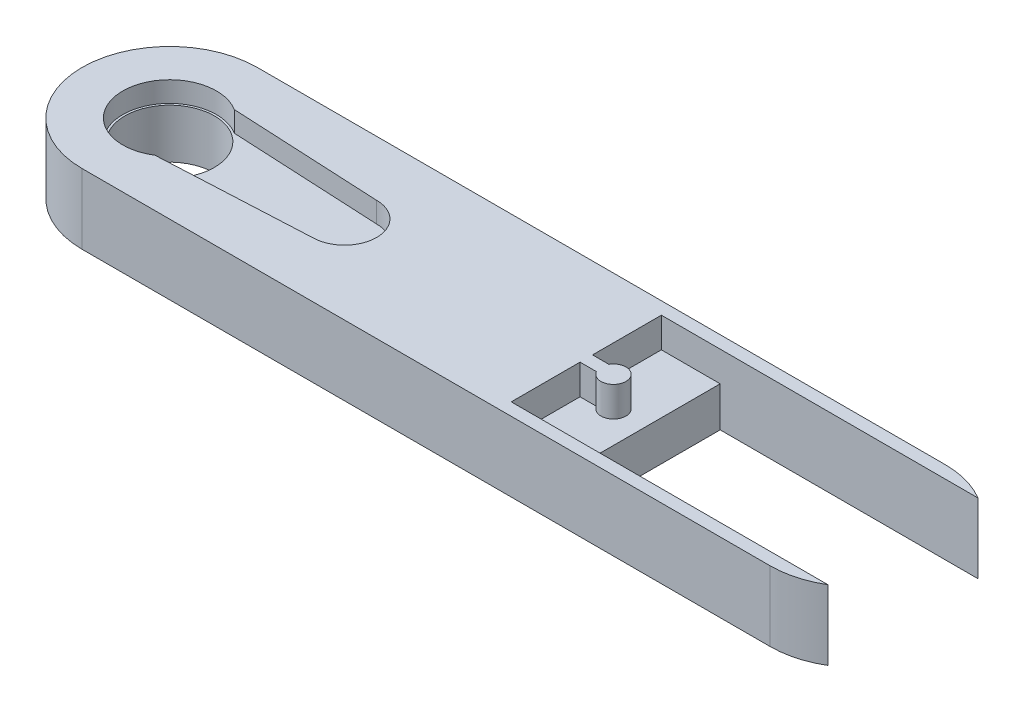
ISO-10303-21;
HEADER;
FILE_DESCRIPTION(('STEP AP214'),'2;1');
FILE_NAME('part.step','',(''),(''),'','','');
FILE_SCHEMA(('AUTOMOTIVE_DESIGN { 1 0 10303 214 1 1 1 1 }'));
ENDSEC;
DATA;
#1=APPLICATION_CONTEXT('core data for automotive mechanical design processes');
#2=APPLICATION_PROTOCOL_DEFINITION('international standard','automotive_design',2000,#1);
#3=PRODUCT_CONTEXT('',#1,'mechanical');
#4=PRODUCT('Part','Part','',(#3));
#5=PRODUCT_RELATED_PRODUCT_CATEGORY('part','',(#4));
#6=PRODUCT_DEFINITION_FORMATION('','',#4);
#7=PRODUCT_DEFINITION_CONTEXT('part definition',#1,'design');
#8=PRODUCT_DEFINITION('design','',#6,#7);
#9=PRODUCT_DEFINITION_SHAPE('','',#8);
#10=(LENGTH_UNIT() NAMED_UNIT(*) SI_UNIT(.MILLI.,.METRE.));
#11=(NAMED_UNIT(*) PLANE_ANGLE_UNIT() SI_UNIT($,.RADIAN.));
#12=(NAMED_UNIT(*) SI_UNIT($,.STERADIAN.) SOLID_ANGLE_UNIT());
#13=UNCERTAINTY_MEASURE_WITH_UNIT(LENGTH_MEASURE(1.E-05),#10,'distance_accuracy_value','');
#14=(GEOMETRIC_REPRESENTATION_CONTEXT(3) GLOBAL_UNCERTAINTY_ASSIGNED_CONTEXT((#13)) GLOBAL_UNIT_ASSIGNED_CONTEXT((#10,
#11,#12)) REPRESENTATION_CONTEXT('',''));
#15=CARTESIAN_POINT('',(0.,0.,0.));
#16=DIRECTION('',(0.,0.,1.));
#17=DIRECTION('',(1.,0.,0.));
#18=AXIS2_PLACEMENT_3D('',#15,#16,#17);
#19=CARTESIAN_POINT('',(55.,3.95,0.));
#20=DIRECTION('',(0.,-1.,0.));
#21=DIRECTION('',(0.,0.,-1.));
#22=AXIS2_PLACEMENT_3D('',#19,#20,#21);
#23=CYLINDRICAL_SURFACE('',#22,7.);
#24=CARTESIAN_POINT('',(55.,0.,0.));
#25=DIRECTION('',(0.,1.,0.));
#26=DIRECTION('',(0.,0.,1.));
#27=AXIS2_PLACEMENT_3D('',#24,#25,#26);
#28=CIRCLE('',#27,7.);
#29=CARTESIAN_POINT('',(55.,0.,7.));
#30=VERTEX_POINT('',#29);
#31=CARTESIAN_POINT('',(58.605551275464,0.,6.));
#32=VERTEX_POINT('',#31);
#33=EDGE_CURVE('E41',#30,#32,#28,.T.);
#34=ORIENTED_EDGE('',*,*,#33,.T.);
#35=DIRECTION('',(0.,-1.,0.));
#36=VECTOR('',#35,1.);
#37=CARTESIAN_POINT('',(58.605551275464,3.95,6.));
#38=LINE('',#37,#36);
#39=CARTESIAN_POINT('',(58.605551275464,5.59,6.));
#40=VERTEX_POINT('',#39);
#41=EDGE_CURVE('E203',#32,#40,#38,.F.);
#42=ORIENTED_EDGE('',*,*,#41,.T.);
#43=CARTESIAN_POINT('',(55.,5.59,0.));
#44=DIRECTION('',(0.,1.,0.));
#45=DIRECTION('',(0.,0.,1.));
#46=AXIS2_PLACEMENT_3D('',#43,#44,#45);
#47=CIRCLE('',#46,7.);
#48=CARTESIAN_POINT('',(55.,5.59,7.));
#49=VERTEX_POINT('',#48);
#50=EDGE_CURVE('E142',#49,#40,#47,.T.);
#51=ORIENTED_EDGE('',*,*,#50,.F.);
#52=DIRECTION('',(0.,-1.,0.));
#53=VECTOR('',#52,1.);
#54=CARTESIAN_POINT('',(55.,3.95,7.));
#55=LINE('',#54,#53);
#56=EDGE_CURVE('E118',#49,#30,#55,.T.);
#57=ORIENTED_EDGE('',*,*,#56,.T.);
#58=EDGE_LOOP('',(#34,#42,#51,#57));
#59=FACE_BOUND('',#58,.T.);
#60=ADVANCED_FACE('F38',(#59),#23,.T.);
#61=CARTESIAN_POINT('',(58.605551275464,5.59,-6.));
#62=VERTEX_POINT('',#61);
#63=CARTESIAN_POINT('',(55.,5.59,-7.));
#64=VERTEX_POINT('',#63);
#65=EDGE_CURVE('E128',#62,#64,#47,.T.);
#66=ORIENTED_EDGE('',*,*,#65,.F.);
#67=DIRECTION('',(0.,-1.,0.));
#68=VECTOR('',#67,1.);
#69=CARTESIAN_POINT('',(58.605551275464,3.95,-6.));
#70=LINE('',#69,#68);
#71=CARTESIAN_POINT('',(58.605551275464,0.,-6.));
#72=VERTEX_POINT('',#71);
#73=EDGE_CURVE('E109',#62,#72,#70,.T.);
#74=ORIENTED_EDGE('',*,*,#73,.T.);
#75=CARTESIAN_POINT('',(55.,0.,-7.));
#76=VERTEX_POINT('',#75);
#77=EDGE_CURVE('E117',#72,#76,#28,.T.);
#78=ORIENTED_EDGE('',*,*,#77,.T.);
#79=DIRECTION('',(0.,-1.,0.));
#80=VECTOR('',#79,1.);
#81=CARTESIAN_POINT('',(55.,3.95,-7.));
#82=LINE('',#81,#80);
#83=EDGE_CURVE('E138',#64,#76,#82,.T.);
#84=ORIENTED_EDGE('',*,*,#83,.F.);
#85=EDGE_LOOP('',(#66,#74,#78,#84));
#86=FACE_BOUND('',#85,.T.);
#87=ADVANCED_FACE('F136',(#86),#23,.T.);
#88=CARTESIAN_POINT('',(0.,5.59,0.));
#89=DIRECTION('',(0.,1.,0.));
#90=DIRECTION('',(0.,0.,1.));
#91=AXIS2_PLACEMENT_3D('',#88,#89,#90);
#92=PLANE('',#91);
#93=ORIENTED_EDGE('',*,*,#50,.T.);
#94=DIRECTION('',(-1.,0.,0.));
#95=VECTOR('',#94,1.);
#96=CARTESIAN_POINT('',(49.5,5.59,6.));
#97=LINE('',#96,#95);
#98=CARTESIAN_POINT('',(33.3,5.59,6.));
#99=VERTEX_POINT('',#98);
#100=EDGE_CURVE('E242',#40,#99,#97,.T.);
#101=ORIENTED_EDGE('',*,*,#100,.T.);
#102=DIRECTION('',(0.,0.,-1.));
#103=VECTOR('',#102,1.);
#104=CARTESIAN_POINT('',(33.3,5.59,0.));
#105=LINE('',#104,#103);
#106=CARTESIAN_POINT('',(33.3,5.59,0.5));
#107=VERTEX_POINT('',#106);
#108=EDGE_CURVE('E147',#99,#107,#105,.T.);
#109=ORIENTED_EDGE('',*,*,#108,.T.);
#110=DIRECTION('',(1.,0.,0.));
#111=VECTOR('',#110,1.);
#112=CARTESIAN_POINT('',(49.5,5.59,0.499999999999996));
#113=LINE('',#112,#111);
#114=CARTESIAN_POINT('',(34.6056199658342,5.59,0.5));
#115=VERTEX_POINT('',#114);
#116=EDGE_CURVE('E145',#107,#115,#113,.T.);
#117=ORIENTED_EDGE('',*,*,#116,.T.);
#118=CARTESIAN_POINT('',(35.4716453696186,5.59,0.));
#119=DIRECTION('',(0.,-1.,0.));
#120=DIRECTION('',(0.,0.,1.));
#121=AXIS2_PLACEMENT_3D('',#118,#119,#120);
#122=CIRCLE('',#121,1.);
#123=CARTESIAN_POINT('',(34.6056199658342,5.59,-0.5));
#124=VERTEX_POINT('',#123);
#125=EDGE_CURVE('E223',#124,#115,#122,.T.);
#126=ORIENTED_EDGE('',*,*,#125,.F.);
#127=DIRECTION('',(1.,0.,0.));
#128=VECTOR('',#127,1.);
#129=CARTESIAN_POINT('',(49.5,5.59,-0.499999999999996));
#130=LINE('',#129,#128);
#131=CARTESIAN_POINT('',(33.3,5.59,-0.5));
#132=VERTEX_POINT('',#131);
#133=EDGE_CURVE('E213',#132,#124,#130,.T.);
#134=ORIENTED_EDGE('',*,*,#133,.F.);
#135=CARTESIAN_POINT('',(33.3,5.59,-6.));
#136=VERTEX_POINT('',#135);
#137=EDGE_CURVE('E132',#132,#136,#105,.T.);
#138=ORIENTED_EDGE('',*,*,#137,.T.);
#139=DIRECTION('',(-1.,0.,0.));
#140=VECTOR('',#139,1.);
#141=CARTESIAN_POINT('',(0.,5.59,-6.));
#142=LINE('',#141,#140);
#143=EDGE_CURVE('E105',#62,#136,#142,.T.);
#144=ORIENTED_EDGE('',*,*,#143,.F.);
#145=ORIENTED_EDGE('',*,*,#65,.T.);
#146=DIRECTION('',(-1.,0.,0.));
#147=VECTOR('',#146,1.);
#148=CARTESIAN_POINT('',(55.,5.59,-7.));
#149=LINE('',#148,#147);
#150=CARTESIAN_POINT('',(0.,5.59,-7.));
#151=VERTEX_POINT('',#150);
#152=EDGE_CURVE('E140',#64,#151,#149,.T.);
#153=ORIENTED_EDGE('',*,*,#152,.T.);
#154=CARTESIAN_POINT('',(0.,5.59,0.));
#155=DIRECTION('',(0.,1.,0.));
#156=DIRECTION('',(0.,0.,1.));
#157=AXIS2_PLACEMENT_3D('',#154,#155,#156);
#158=CIRCLE('',#157,7.);
#159=CARTESIAN_POINT('',(0.,5.59,7.));
#160=VERTEX_POINT('',#159);
#161=EDGE_CURVE('E143',#151,#160,#158,.T.);
#162=ORIENTED_EDGE('',*,*,#161,.T.);
#163=DIRECTION('',(1.,0.,0.));
#164=VECTOR('',#163,1.);
#165=CARTESIAN_POINT('',(0.,5.59,7.));
#166=LINE('',#165,#164);
#167=EDGE_CURVE('E150',#160,#49,#166,.T.);
#168=ORIENTED_EDGE('',*,*,#167,.T.);
#169=EDGE_LOOP('',(#93,#101,#109,#117,#126,#134,#138,#144,#145,#153,#162,#168));
#170=FACE_BOUND('',#169,.T.);
#171=DIRECTION('',(-0.99875866941023,0.,-0.0498108449828539));
#172=VECTOR('',#171,1.);
#173=CARTESIAN_POINT('',(13.9793089820932,5.59,-2.5699963876771));
#174=LINE('',#173,#172);
#175=CARTESIAN_POINT('',(13.9793089820932,5.59,-2.5699963876771));
#176=VERTEX_POINT('',#175);
#177=CARTESIAN_POINT('',(1.99792628223678,5.59,-3.16754093434442));
#178=VERTEX_POINT('',#177);
#179=EDGE_CURVE('E165',#176,#178,#174,.T.);
#180=ORIENTED_EDGE('',*,*,#179,.F.);
#181=CARTESIAN_POINT('',(13.975,5.59,0.));
#182=DIRECTION('',(0.,1.,0.));
#183=DIRECTION('',(0.,0.,1.));
#184=AXIS2_PLACEMENT_3D('',#181,#182,#183);
#185=CIRCLE('',#184,2.57);
#186=CARTESIAN_POINT('',(13.9793089820932,5.59,2.5699963876771));
#187=VERTEX_POINT('',#186);
#188=EDGE_CURVE('E166',#187,#176,#185,.T.);
#189=ORIENTED_EDGE('',*,*,#188,.F.);
#190=DIRECTION('',(0.99875866941023,0.,-0.0498108449828537));
#191=VECTOR('',#190,1.);
#192=CARTESIAN_POINT('',(1.99792628223678,5.59,3.16754093434442));
#193=LINE('',#192,#191);
#194=CARTESIAN_POINT('',(1.99792628223678,5.59,3.16754093434442));
#195=VERTEX_POINT('',#194);
#196=EDGE_CURVE('E174',#195,#187,#193,.T.);
#197=ORIENTED_EDGE('',*,*,#196,.F.);
#198=CARTESIAN_POINT('',(0.,5.59,0.));
#199=DIRECTION('',(0.,1.,0.));
#200=DIRECTION('',(0.,0.,-1.));
#201=AXIS2_PLACEMENT_3D('',#198,#199,#200);
#202=CIRCLE('',#201,3.745);
#203=EDGE_CURVE('E170',#178,#195,#202,.T.);
#204=ORIENTED_EDGE('',*,*,#203,.F.);
#205=EDGE_LOOP('',(#180,#189,#197,#204));
#206=FACE_BOUND('',#205,.T.);
#207=ADVANCED_FACE('F124',(#170,#206),#92,.T.);
#208=CARTESIAN_POINT('',(0.,3.95,0.));
#209=DIRECTION('',(0.,1.,0.));
#210=DIRECTION('',(0.,0.,1.));
#211=AXIS2_PLACEMENT_3D('',#208,#209,#210);
#212=PLANE('',#211);
#213=CARTESIAN_POINT('',(0.,3.95,0.));
#214=DIRECTION('',(0.,-1.,0.));
#215=DIRECTION('',(0.,0.,-1.));
#216=AXIS2_PLACEMENT_3D('',#213,#214,#215);
#217=CIRCLE('',#216,3.575);
#218=CARTESIAN_POINT('',(0.,3.95,-3.575));
#219=VERTEX_POINT('',#218);
#220=EDGE_CURVE('E149',#219,#219,#217,.T.);
#221=ORIENTED_EDGE('',*,*,#220,.T.);
#222=EDGE_LOOP('',(#221));
#223=FACE_BOUND('',#222,.T.);
#224=DIRECTION('',(0.99875866941023,0.,-0.0498108449828537));
#225=VECTOR('',#224,1.);
#226=CARTESIAN_POINT('',(1.99792628223678,3.95,3.16754093434442));
#227=LINE('',#226,#225);
#228=CARTESIAN_POINT('',(1.99792628223678,3.95,3.16754093434442));
#229=VERTEX_POINT('',#228);
#230=CARTESIAN_POINT('',(13.9793089820932,3.95,2.5699963876771));
#231=VERTEX_POINT('',#230);
#232=EDGE_CURVE('E155',#229,#231,#227,.T.);
#233=ORIENTED_EDGE('',*,*,#232,.T.);
#234=CARTESIAN_POINT('',(13.975,3.95,0.));
#235=DIRECTION('',(0.,1.,0.));
#236=DIRECTION('',(0.,0.,1.));
#237=AXIS2_PLACEMENT_3D('',#234,#235,#236);
#238=CIRCLE('',#237,2.57);
#239=CARTESIAN_POINT('',(13.9793089820932,3.95,-2.5699963876771));
#240=VERTEX_POINT('',#239);
#241=EDGE_CURVE('E181',#231,#240,#238,.T.);
#242=ORIENTED_EDGE('',*,*,#241,.T.);
#243=DIRECTION('',(-0.99875866941023,0.,-0.0498108449828539));
#244=VECTOR('',#243,1.);
#245=CARTESIAN_POINT('',(13.9793089820932,3.95,-2.5699963876771));
#246=LINE('',#245,#244);
#247=CARTESIAN_POINT('',(1.99792628223678,3.95,-3.16754093434442));
#248=VERTEX_POINT('',#247);
#249=EDGE_CURVE('E186',#240,#248,#246,.T.);
#250=ORIENTED_EDGE('',*,*,#249,.T.);
#251=CARTESIAN_POINT('',(0.,3.95,0.));
#252=DIRECTION('',(0.,1.,0.));
#253=DIRECTION('',(0.,0.,-1.));
#254=AXIS2_PLACEMENT_3D('',#251,#252,#253);
#255=CIRCLE('',#254,3.745);
#256=EDGE_CURVE('E182',#248,#229,#255,.T.);
#257=ORIENTED_EDGE('',*,*,#256,.T.);
#258=EDGE_LOOP('',(#233,#242,#250,#257));
#259=FACE_BOUND('',#258,.T.);
#260=ADVANCED_FACE('F361',(#223,#259),#212,.T.);
#261=CARTESIAN_POINT('',(0.,3.95,0.));
#262=DIRECTION('',(0.,-1.,0.));
#263=DIRECTION('',(0.,0.,-1.));
#264=AXIS2_PLACEMENT_3D('',#261,#262,#263);
#265=CYLINDRICAL_SURFACE('',#264,7.);
#266=CARTESIAN_POINT('',(0.,0.,0.));
#267=DIRECTION('',(0.,1.,0.));
#268=DIRECTION('',(0.,0.,1.));
#269=AXIS2_PLACEMENT_3D('',#266,#267,#268);
#270=CIRCLE('',#269,7.);
#271=CARTESIAN_POINT('',(0.,0.,-7.));
#272=VERTEX_POINT('',#271);
#273=CARTESIAN_POINT('',(0.,0.,7.));
#274=VERTEX_POINT('',#273);
#275=EDGE_CURVE('E185',#272,#274,#270,.T.);
#276=ORIENTED_EDGE('',*,*,#275,.T.);
#277=DIRECTION('',(0.,-1.,0.));
#278=VECTOR('',#277,1.);
#279=CARTESIAN_POINT('',(0.,3.95,7.));
#280=LINE('',#279,#278);
#281=EDGE_CURVE('E328',#160,#274,#280,.T.);
#282=ORIENTED_EDGE('',*,*,#281,.F.);
#283=ORIENTED_EDGE('',*,*,#161,.F.);
#284=DIRECTION('',(0.,-1.,0.));
#285=VECTOR('',#284,1.);
#286=CARTESIAN_POINT('',(0.,3.95,-7.));
#287=LINE('',#286,#285);
#288=EDGE_CURVE('E335',#151,#272,#287,.T.);
#289=ORIENTED_EDGE('',*,*,#288,.T.);
#290=EDGE_LOOP('',(#276,#282,#283,#289));
#291=FACE_BOUND('',#290,.T.);
#292=ADVANCED_FACE('F366',(#291),#265,.T.);
#293=CARTESIAN_POINT('',(0.,3.95,7.));
#294=DIRECTION('',(0.,0.,-1.));
#295=DIRECTION('',(-1.,0.,0.));
#296=AXIS2_PLACEMENT_3D('',#293,#294,#295);
#297=PLANE('',#296);
#298=DIRECTION('',(1.,0.,0.));
#299=VECTOR('',#298,1.);
#300=CARTESIAN_POINT('',(0.,0.,7.));
#301=LINE('',#300,#299);
#302=EDGE_CURVE('E331',#274,#30,#301,.T.);
#303=ORIENTED_EDGE('',*,*,#302,.T.);
#304=ORIENTED_EDGE('',*,*,#56,.F.);
#305=ORIENTED_EDGE('',*,*,#167,.F.);
#306=ORIENTED_EDGE('',*,*,#281,.T.);
#307=EDGE_LOOP('',(#303,#304,#305,#306));
#308=FACE_BOUND('',#307,.T.);
#309=ADVANCED_FACE('F351',(#308),#297,.F.);
#310=CARTESIAN_POINT('',(0.,3.95,-7.));
#311=DIRECTION('',(0.,0.,1.));
#312=DIRECTION('',(1.,0.,0.));
#313=AXIS2_PLACEMENT_3D('',#310,#311,#312);
#314=PLANE('',#313);
#315=DIRECTION('',(-1.,0.,0.));
#316=VECTOR('',#315,1.);
#317=CARTESIAN_POINT('',(0.,0.,-7.));
#318=LINE('',#317,#316);
#319=EDGE_CURVE('E322',#76,#272,#318,.T.);
#320=ORIENTED_EDGE('',*,*,#319,.T.);
#321=ORIENTED_EDGE('',*,*,#288,.F.);
#322=ORIENTED_EDGE('',*,*,#152,.F.);
#323=ORIENTED_EDGE('',*,*,#83,.T.);
#324=EDGE_LOOP('',(#320,#321,#322,#323));
#325=FACE_BOUND('',#324,.T.);
#326=ADVANCED_FACE('F321',(#325),#314,.F.);
#327=CARTESIAN_POINT('',(0.,0.,0.));
#328=DIRECTION('',(0.,1.,0.));
#329=DIRECTION('',(0.,0.,1.));
#330=AXIS2_PLACEMENT_3D('',#327,#328,#329);
#331=PLANE('',#330);
#332=CARTESIAN_POINT('',(0.,0.,0.));
#333=DIRECTION('',(0.,-1.,0.));
#334=DIRECTION('',(0.,0.,-1.));
#335=AXIS2_PLACEMENT_3D('',#332,#333,#334);
#336=CIRCLE('',#335,3.575);
#337=CARTESIAN_POINT('',(0.,0.,-3.575));
#338=VERTEX_POINT('',#337);
#339=EDGE_CURVE('E199',#338,#338,#336,.T.);
#340=ORIENTED_EDGE('',*,*,#339,.F.);
#341=EDGE_LOOP('',(#340));
#342=FACE_BOUND('',#341,.T.);
#343=DIRECTION('',(0.,0.,1.));
#344=VECTOR('',#343,1.);
#345=CARTESIAN_POINT('',(38.,0.,0.));
#346=LINE('',#345,#344);
#347=CARTESIAN_POINT('',(38.,0.,-6.));
#348=VERTEX_POINT('',#347);
#349=CARTESIAN_POINT('',(38.,0.,6.));
#350=VERTEX_POINT('',#349);
#351=EDGE_CURVE('E55',#348,#350,#346,.T.);
#352=ORIENTED_EDGE('',*,*,#351,.T.);
#353=DIRECTION('',(1.,0.,0.));
#354=VECTOR('',#353,1.);
#355=CARTESIAN_POINT('',(0.,0.,6.));
#356=LINE('',#355,#354);
#357=EDGE_CURVE('E200',#350,#32,#356,.T.);
#358=ORIENTED_EDGE('',*,*,#357,.T.);
#359=ORIENTED_EDGE('',*,*,#33,.F.);
#360=ORIENTED_EDGE('',*,*,#302,.F.);
#361=ORIENTED_EDGE('',*,*,#275,.F.);
#362=ORIENTED_EDGE('',*,*,#319,.F.);
#363=ORIENTED_EDGE('',*,*,#77,.F.);
#364=DIRECTION('',(-1.,0.,0.));
#365=VECTOR('',#364,1.);
#366=CARTESIAN_POINT('',(0.,0.,-6.));
#367=LINE('',#366,#365);
#368=EDGE_CURVE('E112',#72,#348,#367,.T.);
#369=ORIENTED_EDGE('',*,*,#368,.T.);
#370=EDGE_LOOP('',(#352,#358,#359,#360,#361,#362,#363,#369));
#371=FACE_BOUND('',#370,.T.);
#372=ADVANCED_FACE('F326',(#342,#371),#331,.F.);
#373=CARTESIAN_POINT('',(0.,3.95,0.));
#374=DIRECTION('',(0.,-1.,0.));
#375=DIRECTION('',(0.,0.,-1.));
#376=AXIS2_PLACEMENT_3D('',#373,#374,#375);
#377=CYLINDRICAL_SURFACE('',#376,3.575);
#378=ORIENTED_EDGE('',*,*,#220,.F.);
#379=EDGE_LOOP('',(#378));
#380=FACE_BOUND('',#379,.T.);
#381=ORIENTED_EDGE('',*,*,#339,.T.);
#382=EDGE_LOOP('',(#381));
#383=FACE_BOUND('',#382,.T.);
#384=ADVANCED_FACE('F341',(#380,#383),#377,.F.);
#385=CARTESIAN_POINT('',(13.975,5.59,0.));
#386=DIRECTION('',(0.,-1.,0.));
#387=DIRECTION('',(0.,0.,-1.));
#388=AXIS2_PLACEMENT_3D('',#385,#386,#387);
#389=CYLINDRICAL_SURFACE('',#388,2.57);
#390=ORIENTED_EDGE('',*,*,#241,.F.);
#391=DIRECTION('',(0.,-1.,0.));
#392=VECTOR('',#391,1.);
#393=CARTESIAN_POINT('',(13.9793089820932,5.59,2.5699963876771));
#394=LINE('',#393,#392);
#395=EDGE_CURVE('E175',#187,#231,#394,.T.);
#396=ORIENTED_EDGE('',*,*,#395,.F.);
#397=ORIENTED_EDGE('',*,*,#188,.T.);
#398=DIRECTION('',(0.,-1.,0.));
#399=VECTOR('',#398,1.);
#400=CARTESIAN_POINT('',(13.9793089820932,5.59,-2.5699963876771));
#401=LINE('',#400,#399);
#402=EDGE_CURVE('E162',#176,#240,#401,.T.);
#403=ORIENTED_EDGE('',*,*,#402,.T.);
#404=EDGE_LOOP('',(#390,#396,#397,#403));
#405=FACE_BOUND('',#404,.T.);
#406=ADVANCED_FACE('F348',(#405),#389,.F.);
#407=CARTESIAN_POINT('',(13.9793089820932,5.59,-2.5699963876771));
#408=DIRECTION('',(-0.0498108449828539,0.,0.99875866941023));
#409=DIRECTION('',(0.998758669410231,0.,0.0498108449828539));
#410=AXIS2_PLACEMENT_3D('',#407,#408,#409);
#411=PLANE('',#410);
#412=ORIENTED_EDGE('',*,*,#249,.F.);
#413=ORIENTED_EDGE('',*,*,#402,.F.);
#414=ORIENTED_EDGE('',*,*,#179,.T.);
#415=DIRECTION('',(0.,-1.,0.));
#416=VECTOR('',#415,1.);
#417=CARTESIAN_POINT('',(1.99792628223678,5.59,-3.16754093434442));
#418=LINE('',#417,#416);
#419=EDGE_CURVE('E167',#178,#248,#418,.T.);
#420=ORIENTED_EDGE('',*,*,#419,.T.);
#421=EDGE_LOOP('',(#412,#413,#414,#420));
#422=FACE_BOUND('',#421,.T.);
#423=ADVANCED_FACE('F372',(#422),#411,.T.);
#424=CARTESIAN_POINT('',(0.,5.59,0.));
#425=DIRECTION('',(0.,-1.,0.));
#426=DIRECTION('',(0.,0.,-1.));
#427=AXIS2_PLACEMENT_3D('',#424,#425,#426);
#428=CYLINDRICAL_SURFACE('',#427,3.745);
#429=ORIENTED_EDGE('',*,*,#256,.F.);
#430=ORIENTED_EDGE('',*,*,#419,.F.);
#431=ORIENTED_EDGE('',*,*,#203,.T.);
#432=DIRECTION('',(0.,-1.,0.));
#433=VECTOR('',#432,1.);
#434=CARTESIAN_POINT('',(1.99792628223678,5.59,3.16754093434442));
#435=LINE('',#434,#433);
#436=EDGE_CURVE('E171',#195,#229,#435,.T.);
#437=ORIENTED_EDGE('',*,*,#436,.T.);
#438=EDGE_LOOP('',(#429,#430,#431,#437));
#439=FACE_BOUND('',#438,.T.);
#440=ADVANCED_FACE('F376',(#439),#428,.F.);
#441=CARTESIAN_POINT('',(1.99792628223678,5.59,3.16754093434442));
#442=DIRECTION('',(-0.0498108449828537,0.,-0.99875866941023));
#443=DIRECTION('',(-0.998758669410231,0.,0.0498108449828537));
#444=AXIS2_PLACEMENT_3D('',#441,#442,#443);
#445=PLANE('',#444);
#446=ORIENTED_EDGE('',*,*,#232,.F.);
#447=ORIENTED_EDGE('',*,*,#436,.F.);
#448=ORIENTED_EDGE('',*,*,#196,.T.);
#449=ORIENTED_EDGE('',*,*,#395,.T.);
#450=EDGE_LOOP('',(#446,#447,#448,#449));
#451=FACE_BOUND('',#450,.T.);
#452=ADVANCED_FACE('F380',(#451),#445,.T.);
#453=CARTESIAN_POINT('',(49.5,3.19,0.));
#454=DIRECTION('',(0.,-1.,0.));
#455=DIRECTION('',(0.,0.,1.));
#456=AXIS2_PLACEMENT_3D('',#453,#454,#455);
#457=PLANE('',#456);
#458=CARTESIAN_POINT('',(35.4716453696186,3.19,0.));
#459=DIRECTION('',(0.,-1.,0.));
#460=DIRECTION('',(0.,0.,1.));
#461=AXIS2_PLACEMENT_3D('',#458,#459,#460);
#462=CIRCLE('',#461,1.);
#463=CARTESIAN_POINT('',(34.6056199658342,3.19,-0.5));
#464=VERTEX_POINT('',#463);
#465=CARTESIAN_POINT('',(34.6056199658342,3.19,0.5));
#466=VERTEX_POINT('',#465);
#467=EDGE_CURVE('E178',#464,#466,#462,.T.);
#468=ORIENTED_EDGE('',*,*,#467,.T.);
#469=DIRECTION('',(1.,0.,0.));
#470=VECTOR('',#469,1.);
#471=CARTESIAN_POINT('',(49.5,3.19,0.499999999999996));
#472=LINE('',#471,#470);
#473=CARTESIAN_POINT('',(33.3,3.19,0.5));
#474=VERTEX_POINT('',#473);
#475=EDGE_CURVE('E220',#474,#466,#472,.T.);
#476=ORIENTED_EDGE('',*,*,#475,.F.);
#477=DIRECTION('',(0.,0.,-1.));
#478=VECTOR('',#477,1.);
#479=CARTESIAN_POINT('',(33.3,3.19,0.));
#480=LINE('',#479,#478);
#481=CARTESIAN_POINT('',(33.3,3.19,6.));
#482=VERTEX_POINT('',#481);
#483=EDGE_CURVE('E216',#482,#474,#480,.T.);
#484=ORIENTED_EDGE('',*,*,#483,.F.);
#485=DIRECTION('',(-1.,0.,0.));
#486=VECTOR('',#485,1.);
#487=CARTESIAN_POINT('',(49.5,3.19,6.));
#488=LINE('',#487,#486);
#489=CARTESIAN_POINT('',(38.,3.19,6.));
#490=VERTEX_POINT('',#489);
#491=EDGE_CURVE('E47',#490,#482,#488,.T.);
#492=ORIENTED_EDGE('',*,*,#491,.F.);
#493=DIRECTION('',(0.,0.,-1.));
#494=VECTOR('',#493,1.);
#495=CARTESIAN_POINT('',(38.,3.19,0.));
#496=LINE('',#495,#494);
#497=CARTESIAN_POINT('',(38.,3.19,-6.));
#498=VERTEX_POINT('',#497);
#499=EDGE_CURVE('E229',#490,#498,#496,.T.);
#500=ORIENTED_EDGE('',*,*,#499,.T.);
#501=DIRECTION('',(-1.,0.,0.));
#502=VECTOR('',#501,1.);
#503=CARTESIAN_POINT('',(49.5,3.19,-6.));
#504=LINE('',#503,#502);
#505=CARTESIAN_POINT('',(33.3,3.19,-6.));
#506=VERTEX_POINT('',#505);
#507=EDGE_CURVE('E231',#498,#506,#504,.T.);
#508=ORIENTED_EDGE('',*,*,#507,.T.);
#509=CARTESIAN_POINT('',(33.3,3.19,-0.5));
#510=VERTEX_POINT('',#509);
#511=EDGE_CURVE('E212',#510,#506,#480,.T.);
#512=ORIENTED_EDGE('',*,*,#511,.F.);
#513=DIRECTION('',(1.,0.,0.));
#514=VECTOR('',#513,1.);
#515=CARTESIAN_POINT('',(49.5,3.19,-0.499999999999996));
#516=LINE('',#515,#514);
#517=EDGE_CURVE('E234',#510,#464,#516,.T.);
#518=ORIENTED_EDGE('',*,*,#517,.T.);
#519=EDGE_LOOP('',(#468,#476,#484,#492,#500,#508,#512,#518));
#520=FACE_BOUND('',#519,.T.);
#521=ADVANCED_FACE('F264',(#520),#457,.F.);
#522=CARTESIAN_POINT('',(49.5,5.59,-0.499999999999996));
#523=DIRECTION('',(0.,0.,-1.));
#524=DIRECTION('',(1.,0.,0.));
#525=AXIS2_PLACEMENT_3D('',#522,#523,#524);
#526=PLANE('',#525);
#527=ORIENTED_EDGE('',*,*,#517,.F.);
#528=DIRECTION('',(0.,-1.,0.));
#529=VECTOR('',#528,1.);
#530=CARTESIAN_POINT('',(33.3,5.59,-0.5));
#531=LINE('',#530,#529);
#532=EDGE_CURVE('E214',#132,#510,#531,.T.);
#533=ORIENTED_EDGE('',*,*,#532,.F.);
#534=ORIENTED_EDGE('',*,*,#133,.T.);
#535=DIRECTION('',(0.,-1.,0.));
#536=VECTOR('',#535,1.);
#537=CARTESIAN_POINT('',(34.6056199658342,5.59,-0.5));
#538=LINE('',#537,#536);
#539=EDGE_CURVE('E209',#124,#464,#538,.T.);
#540=ORIENTED_EDGE('',*,*,#539,.T.);
#541=EDGE_LOOP('',(#527,#533,#534,#540));
#542=FACE_BOUND('',#541,.T.);
#543=ADVANCED_FACE('F269',(#542),#526,.T.);
#544=CARTESIAN_POINT('',(33.3,5.59,0.));
#545=DIRECTION('',(-1.,0.,0.));
#546=DIRECTION('',(0.,0.,-1.));
#547=AXIS2_PLACEMENT_3D('',#544,#545,#546);
#548=PLANE('',#547);
#549=ORIENTED_EDGE('',*,*,#511,.T.);
#550=DIRECTION('',(0.,-1.,0.));
#551=VECTOR('',#550,1.);
#552=CARTESIAN_POINT('',(33.3,5.59,-6.));
#553=LINE('',#552,#551);
#554=EDGE_CURVE('E133',#136,#506,#553,.T.);
#555=ORIENTED_EDGE('',*,*,#554,.F.);
#556=ORIENTED_EDGE('',*,*,#137,.F.);
#557=ORIENTED_EDGE('',*,*,#532,.T.);
#558=EDGE_LOOP('',(#549,#555,#556,#557));
#559=FACE_BOUND('',#558,.T.);
#560=ADVANCED_FACE('F396',(#559),#548,.F.);
#561=ORIENTED_EDGE('',*,*,#483,.T.);
#562=DIRECTION('',(0.,-1.,0.));
#563=VECTOR('',#562,1.);
#564=CARTESIAN_POINT('',(33.3,5.59,0.5));
#565=LINE('',#564,#563);
#566=EDGE_CURVE('E221',#107,#474,#565,.T.);
#567=ORIENTED_EDGE('',*,*,#566,.F.);
#568=ORIENTED_EDGE('',*,*,#108,.F.);
#569=DIRECTION('',(0.,-1.,0.));
#570=VECTOR('',#569,1.);
#571=CARTESIAN_POINT('',(33.3,5.59,6.));
#572=LINE('',#571,#570);
#573=EDGE_CURVE('E218',#99,#482,#572,.T.);
#574=ORIENTED_EDGE('',*,*,#573,.T.);
#575=EDGE_LOOP('',(#561,#567,#568,#574));
#576=FACE_BOUND('',#575,.T.);
#577=ADVANCED_FACE('F260',(#576),#548,.F.);
#578=CARTESIAN_POINT('',(49.5,5.59,0.499999999999996));
#579=DIRECTION('',(0.,0.,-1.));
#580=DIRECTION('',(1.,0.,0.));
#581=AXIS2_PLACEMENT_3D('',#578,#579,#580);
#582=PLANE('',#581);
#583=ORIENTED_EDGE('',*,*,#475,.T.);
#584=DIRECTION('',(0.,-1.,0.));
#585=VECTOR('',#584,1.);
#586=CARTESIAN_POINT('',(34.6056199658342,5.59,0.5));
#587=LINE('',#586,#585);
#588=EDGE_CURVE('E134',#115,#466,#587,.T.);
#589=ORIENTED_EDGE('',*,*,#588,.F.);
#590=ORIENTED_EDGE('',*,*,#116,.F.);
#591=ORIENTED_EDGE('',*,*,#566,.T.);
#592=EDGE_LOOP('',(#583,#589,#590,#591));
#593=FACE_BOUND('',#592,.T.);
#594=ADVANCED_FACE('F253',(#593),#582,.F.);
#595=CARTESIAN_POINT('',(35.4716453696186,5.59,0.));
#596=DIRECTION('',(0.,-1.,0.));
#597=DIRECTION('',(0.,0.,1.));
#598=AXIS2_PLACEMENT_3D('',#595,#596,#597);
#599=CYLINDRICAL_SURFACE('',#598,1.);
#600=ORIENTED_EDGE('',*,*,#467,.F.);
#601=ORIENTED_EDGE('',*,*,#539,.F.);
#602=ORIENTED_EDGE('',*,*,#125,.T.);
#603=ORIENTED_EDGE('',*,*,#588,.T.);
#604=EDGE_LOOP('',(#600,#601,#602,#603));
#605=FACE_BOUND('',#604,.T.);
#606=ADVANCED_FACE('F250',(#605),#599,.T.);
#607=CARTESIAN_POINT('',(61.,21.79,-6.));
#608=DIRECTION('',(0.,0.,-1.));
#609=DIRECTION('',(1.,0.,0.));
#610=AXIS2_PLACEMENT_3D('',#607,#608,#609);
#611=PLANE('',#610);
#612=ORIENTED_EDGE('',*,*,#73,.F.);
#613=ORIENTED_EDGE('',*,*,#143,.T.);
#614=ORIENTED_EDGE('',*,*,#554,.T.);
#615=ORIENTED_EDGE('',*,*,#507,.F.);
#616=DIRECTION('',(0.,-1.,0.));
#617=VECTOR('',#616,1.);
#618=CARTESIAN_POINT('',(38.,21.79,-6.));
#619=LINE('',#618,#617);
#620=EDGE_CURVE('E207',#498,#348,#619,.T.);
#621=ORIENTED_EDGE('',*,*,#620,.T.);
#622=ORIENTED_EDGE('',*,*,#368,.F.);
#623=EDGE_LOOP('',(#612,#613,#614,#615,#621,#622));
#624=FACE_BOUND('',#623,.T.);
#625=ADVANCED_FACE('F110',(#624),#611,.F.);
#626=CARTESIAN_POINT('',(61.,21.79,6.));
#627=DIRECTION('',(0.,0.,1.));
#628=DIRECTION('',(-1.,0.,0.));
#629=AXIS2_PLACEMENT_3D('',#626,#627,#628);
#630=PLANE('',#629);
#631=DIRECTION('',(0.,-1.,0.));
#632=VECTOR('',#631,1.);
#633=CARTESIAN_POINT('',(38.,21.79,6.));
#634=LINE('',#633,#632);
#635=EDGE_CURVE('E11',#490,#350,#634,.T.);
#636=ORIENTED_EDGE('',*,*,#635,.F.);
#637=ORIENTED_EDGE('',*,*,#491,.T.);
#638=ORIENTED_EDGE('',*,*,#573,.F.);
#639=ORIENTED_EDGE('',*,*,#100,.F.);
#640=ORIENTED_EDGE('',*,*,#41,.F.);
#641=ORIENTED_EDGE('',*,*,#357,.F.);
#642=EDGE_LOOP('',(#636,#637,#638,#639,#640,#641));
#643=FACE_BOUND('',#642,.T.);
#644=ADVANCED_FACE('F313',(#643),#630,.F.);
#645=CARTESIAN_POINT('',(38.,21.79,6.));
#646=DIRECTION('',(-1.,0.,0.));
#647=DIRECTION('',(0.,0.,-1.));
#648=AXIS2_PLACEMENT_3D('',#645,#646,#647);
#649=PLANE('',#648);
#650=ORIENTED_EDGE('',*,*,#620,.F.);
#651=ORIENTED_EDGE('',*,*,#499,.F.);
#652=ORIENTED_EDGE('',*,*,#635,.T.);
#653=ORIENTED_EDGE('',*,*,#351,.F.);
#654=EDGE_LOOP('',(#650,#651,#652,#653));
#655=FACE_BOUND('',#654,.T.);
#656=ADVANCED_FACE('F385',(#655),#649,.F.);
#657=CLOSED_SHELL('',(#60,#87,#207,#260,#292,#309,#326,#372,#384,#406,#423,#440,#452,#521,#543,
#560,#577,#594,#606,#625,#644,#656));
#658=MANIFOLD_SOLID_BREP('B2',#657);
#659=ADVANCED_BREP_SHAPE_REPRESENTATION('',(#18,#658),#14);
#660=SHAPE_DEFINITION_REPRESENTATION(#9,#659);
ENDSEC;
END-ISO-10303-21;
